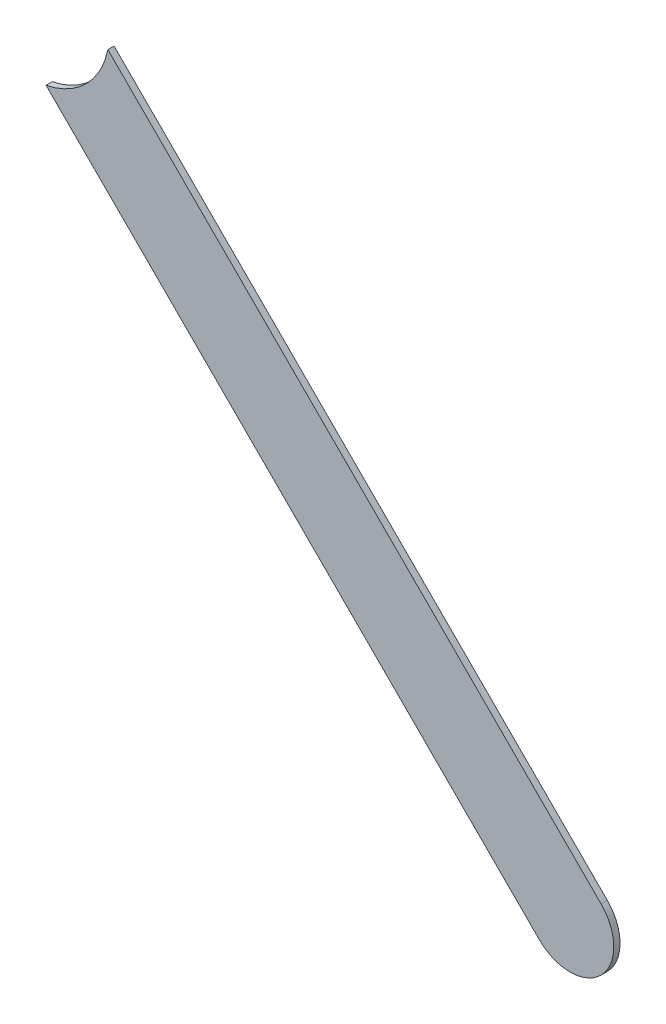
ISO-10303-21;
HEADER;
FILE_DESCRIPTION(('STEP AP214'),'2;1');
FILE_NAME('part.step','',(''),(''),'','','');
FILE_SCHEMA(('AUTOMOTIVE_DESIGN { 1 0 10303 214 1 1 1 1 }'));
ENDSEC;
DATA;
#1=APPLICATION_CONTEXT('core data for automotive mechanical design processes');
#2=APPLICATION_PROTOCOL_DEFINITION('international standard','automotive_design',2000,#1);
#3=PRODUCT_CONTEXT('',#1,'mechanical');
#4=PRODUCT('Part','Part','',(#3));
#5=PRODUCT_RELATED_PRODUCT_CATEGORY('part','',(#4));
#6=PRODUCT_DEFINITION_FORMATION('','',#4);
#7=PRODUCT_DEFINITION_CONTEXT('part definition',#1,'design');
#8=PRODUCT_DEFINITION('design','',#6,#7);
#9=PRODUCT_DEFINITION_SHAPE('','',#8);
#10=(LENGTH_UNIT() NAMED_UNIT(*) SI_UNIT(.MILLI.,.METRE.));
#11=(NAMED_UNIT(*) PLANE_ANGLE_UNIT() SI_UNIT($,.RADIAN.));
#12=(NAMED_UNIT(*) SI_UNIT($,.STERADIAN.) SOLID_ANGLE_UNIT());
#13=UNCERTAINTY_MEASURE_WITH_UNIT(LENGTH_MEASURE(1.E-05),#10,'distance_accuracy_value','');
#14=(GEOMETRIC_REPRESENTATION_CONTEXT(3) GLOBAL_UNCERTAINTY_ASSIGNED_CONTEXT((#13)) GLOBAL_UNIT_ASSIGNED_CONTEXT((#10,
#11,#12)) REPRESENTATION_CONTEXT('',''));
#15=CARTESIAN_POINT('',(0.,0.,0.));
#16=DIRECTION('',(0.,0.,1.));
#17=DIRECTION('',(1.,0.,0.));
#18=AXIS2_PLACEMENT_3D('',#15,#16,#17);
#19=CARTESIAN_POINT('',(39.4877981363948,95.5586500836052,0.));
#20=DIRECTION('',(0.707106781186548,0.707106781186548,0.));
#21=DIRECTION('',(0.707106781186548,-0.707106781186548,0.));
#22=AXIS2_PLACEMENT_3D('',#19,#20,#21);
#23=PLANE('',#22);
#24=DIRECTION('',(0.707106781186548,-0.707106781186548,0.));
#25=VECTOR('',#24,1.);
#26=CARTESIAN_POINT('',(39.22322356,95.82322466,0.03556));
#27=LINE('',#26,#25);
#28=CARTESIAN_POINT('',(39.4877981363948,95.5586500836052,0.03556));
#29=VERTEX_POINT('',#28);
#30=CARTESIAN_POINT('',(42.30921434,92.73723388,0.03556));
#31=VERTEX_POINT('',#30);
#32=EDGE_CURVE('E11',#29,#31,#27,.T.);
#33=ORIENTED_EDGE('',*,*,#32,.F.);
#34=DIRECTION('',(0.,0.,1.));
#35=VECTOR('',#34,1.);
#36=CARTESIAN_POINT('',(39.4877981363948,95.5586500836052,0.));
#37=LINE('',#36,#35);
#38=CARTESIAN_POINT('',(39.4877981363948,95.5586500836052,0.));
#39=VERTEX_POINT('',#38);
#40=EDGE_CURVE('E24',#39,#29,#37,.T.);
#41=ORIENTED_EDGE('',*,*,#40,.F.);
#42=DIRECTION('',(0.707106781186548,-0.707106781186548,0.));
#43=VECTOR('',#42,1.);
#44=CARTESIAN_POINT('',(39.22322356,95.82322466,0.));
#45=LINE('',#44,#43);
#46=CARTESIAN_POINT('',(42.30921434,92.73723388,0.));
#47=VERTEX_POINT('',#46);
#48=EDGE_CURVE('E75',#39,#47,#45,.T.);
#49=ORIENTED_EDGE('',*,*,#48,.T.);
#50=DIRECTION('',(0.,0.,1.));
#51=VECTOR('',#50,1.);
#52=CARTESIAN_POINT('',(42.30921434,92.73723388,0.));
#53=LINE('',#52,#51);
#54=EDGE_CURVE('E37',#47,#31,#53,.T.);
#55=ORIENTED_EDGE('',*,*,#54,.T.);
#56=EDGE_LOOP('',(#33,#41,#49,#55));
#57=FACE_BOUND('',#56,.T.);
#58=ADVANCED_FACE('F17',(#57),#23,.F.);
#59=CARTESIAN_POINT('',(42.48599072,92.91401026,0.));
#60=DIRECTION('',(0.,0.,-1.));
#61=DIRECTION('',(-0.707106781186533,-0.707106781186562,0.));
#62=AXIS2_PLACEMENT_3D('',#59,#60,#61);
#63=CYLINDRICAL_SURFACE('',#62,0.249999554103221);
#64=CARTESIAN_POINT('',(42.48599072,92.91401026,0.03556));
#65=DIRECTION('',(0.,0.,1.));
#66=DIRECTION('',(-0.707106781186533,-0.707106781186562,0.));
#67=AXIS2_PLACEMENT_3D('',#64,#65,#66);
#68=CIRCLE('',#67,0.249999554103221);
#69=CARTESIAN_POINT('',(42.6627671,93.09078664,0.03556));
#70=VERTEX_POINT('',#69);
#71=EDGE_CURVE('E83',#31,#70,#68,.T.);
#72=ORIENTED_EDGE('',*,*,#71,.F.);
#73=ORIENTED_EDGE('',*,*,#54,.F.);
#74=CARTESIAN_POINT('',(42.48599072,92.91401026,0.));
#75=DIRECTION('',(0.,0.,1.));
#76=DIRECTION('',(-0.707106781186533,-0.707106781186562,0.));
#77=AXIS2_PLACEMENT_3D('',#74,#75,#76);
#78=CIRCLE('',#77,0.249999554103221);
#79=CARTESIAN_POINT('',(42.6627671,93.09078664,0.));
#80=VERTEX_POINT('',#79);
#81=EDGE_CURVE('E81',#47,#80,#78,.T.);
#82=ORIENTED_EDGE('',*,*,#81,.T.);
#83=DIRECTION('',(0.,0.,1.));
#84=VECTOR('',#83,1.);
#85=CARTESIAN_POINT('',(42.6627671,93.09078664,0.));
#86=LINE('',#85,#84);
#87=EDGE_CURVE('E67',#80,#70,#86,.T.);
#88=ORIENTED_EDGE('',*,*,#87,.T.);
#89=EDGE_LOOP('',(#72,#73,#82,#88));
#90=FACE_BOUND('',#89,.T.);
#91=ADVANCED_FACE('F89',(#90),#63,.T.);
#92=CARTESIAN_POINT('',(42.6627671,93.09078664,0.));
#93=DIRECTION('',(-0.707106781186548,-0.707106781186547,0.));
#94=DIRECTION('',(-0.707106781186547,0.707106781186548,0.));
#95=AXIS2_PLACEMENT_3D('',#92,#93,#94);
#96=PLANE('',#95);
#97=DIRECTION('',(-0.707106781186547,0.707106781186548,0.));
#98=VECTOR('',#97,1.);
#99=CARTESIAN_POINT('',(42.6627671,93.09078664,0.03556));
#100=LINE('',#99,#98);
#101=CARTESIAN_POINT('',(39.8413508963948,95.9122028436052,0.03556));
#102=VERTEX_POINT('',#101);
#103=EDGE_CURVE('E71',#70,#102,#100,.T.);
#104=ORIENTED_EDGE('',*,*,#103,.F.);
#105=ORIENTED_EDGE('',*,*,#87,.F.);
#106=DIRECTION('',(-0.707106781186547,0.707106781186548,0.));
#107=VECTOR('',#106,1.);
#108=CARTESIAN_POINT('',(42.6627671,93.09078664,0.));
#109=LINE('',#108,#107);
#110=CARTESIAN_POINT('',(39.8413508963948,95.9122028436052,0.));
#111=VERTEX_POINT('',#110);
#112=EDGE_CURVE('E63',#80,#111,#109,.T.);
#113=ORIENTED_EDGE('',*,*,#112,.T.);
#114=DIRECTION('',(0.,0.,1.));
#115=VECTOR('',#114,1.);
#116=CARTESIAN_POINT('',(39.8413508963948,95.9122028436052,0.));
#117=LINE('',#116,#115);
#118=EDGE_CURVE('E53',#111,#102,#117,.T.);
#119=ORIENTED_EDGE('',*,*,#118,.T.);
#120=EDGE_LOOP('',(#104,#105,#113,#119));
#121=FACE_BOUND('',#120,.T.);
#122=ADVANCED_FACE('F66',(#121),#96,.F.);
#123=CARTESIAN_POINT('',(39.39999994,96.00000104,0.));
#124=DIRECTION('',(0.,0.,-1.));
#125=DIRECTION('',(1.,0.,0.));
#126=AXIS2_PLACEMENT_3D('',#123,#124,#125);
#127=CYLINDRICAL_SURFACE('',#126,0.4499991);
#128=ORIENTED_EDGE('',*,*,#40,.T.);
#129=CARTESIAN_POINT('',(39.39999994,96.00000104,0.03556));
#130=DIRECTION('',(0.,0.,1.));
#131=DIRECTION('',(1.,0.,0.));
#132=AXIS2_PLACEMENT_3D('',#129,#130,#131);
#133=CIRCLE('',#132,0.4499991);
#134=EDGE_CURVE('E59',#29,#102,#133,.T.);
#135=ORIENTED_EDGE('',*,*,#134,.T.);
#136=ORIENTED_EDGE('',*,*,#118,.F.);
#137=CARTESIAN_POINT('',(39.39999994,96.00000104,0.));
#138=DIRECTION('',(0.,0.,1.));
#139=DIRECTION('',(1.,0.,0.));
#140=AXIS2_PLACEMENT_3D('',#137,#138,#139);
#141=CIRCLE('',#140,0.4499991);
#142=EDGE_CURVE('E57',#39,#111,#141,.T.);
#143=ORIENTED_EDGE('',*,*,#142,.F.);
#144=EDGE_LOOP('',(#128,#135,#136,#143));
#145=FACE_BOUND('',#144,.T.);
#146=ADVANCED_FACE('F55',(#145),#127,.F.);
#147=CARTESIAN_POINT('',(39.22322356,95.82322466,0.));
#148=DIRECTION('',(0.,0.,-1.));
#149=DIRECTION('',(-1.,0.,0.));
#150=AXIS2_PLACEMENT_3D('',#147,#148,#149);
#151=PLANE('',#150);
#152=ORIENTED_EDGE('',*,*,#48,.F.);
#153=ORIENTED_EDGE('',*,*,#142,.T.);
#154=ORIENTED_EDGE('',*,*,#112,.F.);
#155=ORIENTED_EDGE('',*,*,#81,.F.);
#156=EDGE_LOOP('',(#152,#153,#154,#155));
#157=FACE_BOUND('',#156,.T.);
#158=ADVANCED_FACE('F74',(#157),#151,.T.);
#159=CARTESIAN_POINT('',(39.22322356,95.82322466,0.03556));
#160=DIRECTION('',(0.,0.,-1.));
#161=DIRECTION('',(-1.,0.,0.));
#162=AXIS2_PLACEMENT_3D('',#159,#160,#161);
#163=PLANE('',#162);
#164=ORIENTED_EDGE('',*,*,#134,.F.);
#165=ORIENTED_EDGE('',*,*,#32,.T.);
#166=ORIENTED_EDGE('',*,*,#71,.T.);
#167=ORIENTED_EDGE('',*,*,#103,.T.);
#168=EDGE_LOOP('',(#164,#165,#166,#167));
#169=FACE_BOUND('',#168,.T.);
#170=ADVANCED_FACE('F91',(#169),#163,.F.);
#171=CLOSED_SHELL('',(#58,#91,#122,#146,#158,#170));
#172=MANIFOLD_SOLID_BREP('B1',#171);
#173=ADVANCED_BREP_SHAPE_REPRESENTATION('',(#18,#172),#14);
#174=SHAPE_DEFINITION_REPRESENTATION(#9,#173);
ENDSEC;
END-ISO-10303-21;
